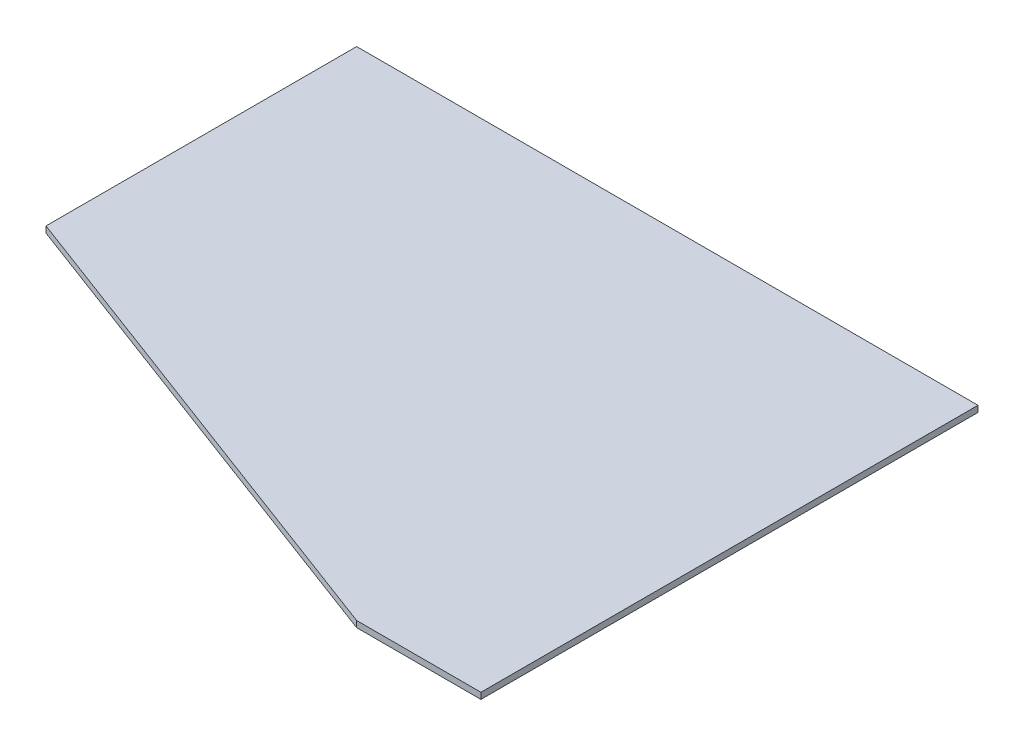
ISO-10303-21;
HEADER;
FILE_DESCRIPTION(('STEP AP214'),'2;1');
FILE_NAME('part.step','',(''),(''),'','','');
FILE_SCHEMA(('AUTOMOTIVE_DESIGN { 1 0 10303 214 1 1 1 1 }'));
ENDSEC;
DATA;
#1=APPLICATION_CONTEXT('core data for automotive mechanical design processes');
#2=APPLICATION_PROTOCOL_DEFINITION('international standard','automotive_design',2000,#1);
#3=PRODUCT_CONTEXT('',#1,'mechanical');
#4=PRODUCT('Part','Part','',(#3));
#5=PRODUCT_RELATED_PRODUCT_CATEGORY('part','',(#4));
#6=PRODUCT_DEFINITION_FORMATION('','',#4);
#7=PRODUCT_DEFINITION_CONTEXT('part definition',#1,'design');
#8=PRODUCT_DEFINITION('design','',#6,#7);
#9=PRODUCT_DEFINITION_SHAPE('','',#8);
#10=(LENGTH_UNIT() NAMED_UNIT(*) SI_UNIT(.MILLI.,.METRE.));
#11=(NAMED_UNIT(*) PLANE_ANGLE_UNIT() SI_UNIT($,.RADIAN.));
#12=(NAMED_UNIT(*) SI_UNIT($,.STERADIAN.) SOLID_ANGLE_UNIT());
#13=UNCERTAINTY_MEASURE_WITH_UNIT(LENGTH_MEASURE(1.E-05),#10,'distance_accuracy_value','');
#14=(GEOMETRIC_REPRESENTATION_CONTEXT(3) GLOBAL_UNCERTAINTY_ASSIGNED_CONTEXT((#13)) GLOBAL_UNIT_ASSIGNED_CONTEXT((#10,
#11,#12)) REPRESENTATION_CONTEXT('',''));
#15=CARTESIAN_POINT('',(0.,0.,0.));
#16=DIRECTION('',(0.,0.,1.));
#17=DIRECTION('',(1.,0.,0.));
#18=AXIS2_PLACEMENT_3D('',#15,#16,#17);
#19=CARTESIAN_POINT('',(1500.,10.,0.));
#20=DIRECTION('',(-1.,0.,0.));
#21=DIRECTION('',(0.,0.,1.));
#22=AXIS2_PLACEMENT_3D('',#19,#20,#21);
#23=PLANE('',#22);
#24=DIRECTION('',(0.,0.,-1.));
#25=VECTOR('',#24,1.);
#26=CARTESIAN_POINT('',(1500.,0.,0.));
#27=LINE('',#26,#25);
#28=CARTESIAN_POINT('',(1500.,0.,0.));
#29=VERTEX_POINT('',#28);
#30=CARTESIAN_POINT('',(1500.,0.,-800.));
#31=VERTEX_POINT('',#30);
#32=EDGE_CURVE('E109',#29,#31,#27,.T.);
#33=ORIENTED_EDGE('',*,*,#32,.T.);
#34=DIRECTION('',(0.,-1.,0.));
#35=VECTOR('',#34,1.);
#36=CARTESIAN_POINT('',(1500.,10.,-800.));
#37=LINE('',#36,#35);
#38=CARTESIAN_POINT('',(1500.,10.,-800.));
#39=VERTEX_POINT('',#38);
#40=EDGE_CURVE('E11',#39,#31,#37,.T.);
#41=ORIENTED_EDGE('',*,*,#40,.F.);
#42=DIRECTION('',(0.,0.,-1.));
#43=VECTOR('',#42,1.);
#44=CARTESIAN_POINT('',(1500.,10.,0.));
#45=LINE('',#44,#43);
#46=CARTESIAN_POINT('',(1500.,10.,0.));
#47=VERTEX_POINT('',#46);
#48=EDGE_CURVE('E118',#47,#39,#45,.T.);
#49=ORIENTED_EDGE('',*,*,#48,.F.);
#50=DIRECTION('',(0.,-1.,0.));
#51=VECTOR('',#50,1.);
#52=CARTESIAN_POINT('',(1500.,10.,0.));
#53=LINE('',#52,#51);
#54=EDGE_CURVE('E105',#47,#29,#53,.T.);
#55=ORIENTED_EDGE('',*,*,#54,.T.);
#56=EDGE_LOOP('',(#33,#41,#49,#55));
#57=FACE_BOUND('',#56,.T.);
#58=ADVANCED_FACE('F35',(#57),#23,.F.);
#59=CARTESIAN_POINT('',(500.,10.,-800.));
#60=DIRECTION('',(0.,0.,1.));
#61=DIRECTION('',(1.,0.,0.));
#62=AXIS2_PLACEMENT_3D('',#59,#60,#61);
#63=PLANE('',#62);
#64=DIRECTION('',(-1.,0.,0.));
#65=VECTOR('',#64,1.);
#66=CARTESIAN_POINT('',(500.,0.,-800.));
#67=LINE('',#66,#65);
#68=CARTESIAN_POINT('',(500.,0.,-800.));
#69=VERTEX_POINT('',#68);
#70=EDGE_CURVE('E112',#31,#69,#67,.T.);
#71=ORIENTED_EDGE('',*,*,#70,.T.);
#72=DIRECTION('',(0.,-1.,0.));
#73=VECTOR('',#72,1.);
#74=CARTESIAN_POINT('',(500.,10.,-800.));
#75=LINE('',#74,#73);
#76=CARTESIAN_POINT('',(500.,10.,-800.));
#77=VERTEX_POINT('',#76);
#78=EDGE_CURVE('E43',#77,#69,#75,.T.);
#79=ORIENTED_EDGE('',*,*,#78,.F.);
#80=DIRECTION('',(-1.,0.,0.));
#81=VECTOR('',#80,1.);
#82=CARTESIAN_POINT('',(500.,10.,-800.));
#83=LINE('',#82,#81);
#84=EDGE_CURVE('E85',#39,#77,#83,.T.);
#85=ORIENTED_EDGE('',*,*,#84,.F.);
#86=ORIENTED_EDGE('',*,*,#40,.T.);
#87=EDGE_LOOP('',(#71,#79,#85,#86));
#88=FACE_BOUND('',#87,.T.);
#89=ADVANCED_FACE('F137',(#88),#63,.F.);
#90=CARTESIAN_POINT('',(500.,10.,-300.));
#91=DIRECTION('',(1.,0.,0.));
#92=DIRECTION('',(0.,0.,-1.));
#93=AXIS2_PLACEMENT_3D('',#90,#91,#92);
#94=PLANE('',#93);
#95=DIRECTION('',(0.,0.,1.));
#96=VECTOR('',#95,1.);
#97=CARTESIAN_POINT('',(500.,0.,-300.));
#98=LINE('',#97,#96);
#99=CARTESIAN_POINT('',(500.,0.,-300.));
#100=VERTEX_POINT('',#99);
#101=EDGE_CURVE('E100',#69,#100,#98,.T.);
#102=ORIENTED_EDGE('',*,*,#101,.T.);
#103=DIRECTION('',(0.,-1.,0.));
#104=VECTOR('',#103,1.);
#105=CARTESIAN_POINT('',(500.,10.,-300.));
#106=LINE('',#105,#104);
#107=CARTESIAN_POINT('',(500.,10.,-300.));
#108=VERTEX_POINT('',#107);
#109=EDGE_CURVE('E97',#108,#100,#106,.T.);
#110=ORIENTED_EDGE('',*,*,#109,.F.);
#111=DIRECTION('',(0.,0.,1.));
#112=VECTOR('',#111,1.);
#113=CARTESIAN_POINT('',(500.,10.,-300.));
#114=LINE('',#113,#112);
#115=EDGE_CURVE('E89',#77,#108,#114,.T.);
#116=ORIENTED_EDGE('',*,*,#115,.F.);
#117=ORIENTED_EDGE('',*,*,#78,.T.);
#118=EDGE_LOOP('',(#102,#110,#116,#117));
#119=FACE_BOUND('',#118,.T.);
#120=ADVANCED_FACE('F98',(#119),#94,.F.);
#121=CARTESIAN_POINT('',(1300.,10.,0.));
#122=DIRECTION('',(0.351123441588391,0.,-0.936329177569045));
#123=DIRECTION('',(-0.936329177569045,0.,-0.351123441588392));
#124=AXIS2_PLACEMENT_3D('',#121,#122,#123);
#125=PLANE('',#124);
#126=DIRECTION('',(0.936329177569044,0.,0.351123441588391));
#127=VECTOR('',#126,1.);
#128=CARTESIAN_POINT('',(1300.,0.,0.));
#129=LINE('',#128,#127);
#130=CARTESIAN_POINT('',(1300.,0.,0.));
#131=VERTEX_POINT('',#130);
#132=EDGE_CURVE('E71',#100,#131,#129,.T.);
#133=ORIENTED_EDGE('',*,*,#132,.T.);
#134=DIRECTION('',(0.,-1.,0.));
#135=VECTOR('',#134,1.);
#136=CARTESIAN_POINT('',(1300.,10.,0.));
#137=LINE('',#136,#135);
#138=CARTESIAN_POINT('',(1300.,10.,0.));
#139=VERTEX_POINT('',#138);
#140=EDGE_CURVE('E101',#139,#131,#137,.T.);
#141=ORIENTED_EDGE('',*,*,#140,.F.);
#142=DIRECTION('',(0.936329177569044,0.,0.351123441588391));
#143=VECTOR('',#142,1.);
#144=CARTESIAN_POINT('',(1300.,10.,0.));
#145=LINE('',#144,#143);
#146=EDGE_CURVE('E93',#108,#139,#145,.T.);
#147=ORIENTED_EDGE('',*,*,#146,.F.);
#148=ORIENTED_EDGE('',*,*,#109,.T.);
#149=EDGE_LOOP('',(#133,#141,#147,#148));
#150=FACE_BOUND('',#149,.T.);
#151=ADVANCED_FACE('F103',(#150),#125,.F.);
#152=CARTESIAN_POINT('',(1300.,10.,0.));
#153=DIRECTION('',(0.,0.,-1.));
#154=DIRECTION('',(-1.,0.,0.));
#155=AXIS2_PLACEMENT_3D('',#152,#153,#154);
#156=PLANE('',#155);
#157=DIRECTION('',(1.,0.,0.));
#158=VECTOR('',#157,1.);
#159=CARTESIAN_POINT('',(1300.,0.,0.));
#160=LINE('',#159,#158);
#161=EDGE_CURVE('E77',#131,#29,#160,.T.);
#162=ORIENTED_EDGE('',*,*,#161,.T.);
#163=ORIENTED_EDGE('',*,*,#54,.F.);
#164=DIRECTION('',(1.,0.,0.));
#165=VECTOR('',#164,1.);
#166=CARTESIAN_POINT('',(1300.,10.,0.));
#167=LINE('',#166,#165);
#168=EDGE_CURVE('E51',#139,#47,#167,.T.);
#169=ORIENTED_EDGE('',*,*,#168,.F.);
#170=ORIENTED_EDGE('',*,*,#140,.T.);
#171=EDGE_LOOP('',(#162,#163,#169,#170));
#172=FACE_BOUND('',#171,.T.);
#173=ADVANCED_FACE('F126',(#172),#156,.F.);
#174=CARTESIAN_POINT('',(0.,10.,0.));
#175=DIRECTION('',(0.,-1.,0.));
#176=DIRECTION('',(0.,0.,-1.));
#177=AXIS2_PLACEMENT_3D('',#174,#175,#176);
#178=PLANE('',#177);
#179=ORIENTED_EDGE('',*,*,#48,.T.);
#180=ORIENTED_EDGE('',*,*,#84,.T.);
#181=ORIENTED_EDGE('',*,*,#115,.T.);
#182=ORIENTED_EDGE('',*,*,#146,.T.);
#183=ORIENTED_EDGE('',*,*,#168,.T.);
#184=EDGE_LOOP('',(#179,#180,#181,#182,#183));
#185=FACE_BOUND('',#184,.T.);
#186=ADVANCED_FACE('F91',(#185),#178,.F.);
#187=CARTESIAN_POINT('',(0.,0.,0.));
#188=DIRECTION('',(0.,-1.,0.));
#189=DIRECTION('',(0.,0.,-1.));
#190=AXIS2_PLACEMENT_3D('',#187,#188,#189);
#191=PLANE('',#190);
#192=CARTESIAN_POINT('',(1400.,0.,-700.));
#193=DIRECTION('',(0.,-1.,0.));
#194=DIRECTION('',(0.,0.,-1.));
#195=AXIS2_PLACEMENT_3D('',#192,#193,#194);
#196=CIRCLE('',#195,39.9999999999999);
#197=CARTESIAN_POINT('',(1400.,0.,-740.));
#198=VERTEX_POINT('',#197);
#199=EDGE_CURVE('E217',#198,#198,#196,.T.);
#200=ORIENTED_EDGE('',*,*,#199,.F.);
#201=EDGE_LOOP('',(#200));
#202=FACE_BOUND('',#201,.T.);
#203=CARTESIAN_POINT('',(1400.,0.,-120.));
#204=DIRECTION('',(0.,-1.,0.));
#205=DIRECTION('',(0.,0.,-1.));
#206=AXIS2_PLACEMENT_3D('',#203,#204,#205);
#207=CIRCLE('',#206,39.9999999999999);
#208=CARTESIAN_POINT('',(1400.,0.,-160.));
#209=VERTEX_POINT('',#208);
#210=EDGE_CURVE('E216',#209,#209,#207,.T.);
#211=ORIENTED_EDGE('',*,*,#210,.F.);
#212=EDGE_LOOP('',(#211));
#213=FACE_BOUND('',#212,.T.);
#214=ORIENTED_EDGE('',*,*,#32,.F.);
#215=ORIENTED_EDGE('',*,*,#161,.F.);
#216=ORIENTED_EDGE('',*,*,#132,.F.);
#217=ORIENTED_EDGE('',*,*,#101,.F.);
#218=ORIENTED_EDGE('',*,*,#70,.F.);
#219=EDGE_LOOP('',(#214,#215,#216,#217,#218));
#220=FACE_BOUND('',#219,.T.);
#221=ADVANCED_FACE('F122',(#202,#213,#220),#191,.T.);
#222=CARTESIAN_POINT('',(1400.,5.,-120.));
#223=DIRECTION('',(0.,-1.,0.));
#224=DIRECTION('',(0.,0.,-1.));
#225=AXIS2_PLACEMENT_3D('',#222,#223,#224);
#226=CYLINDRICAL_SURFACE('',#225,39.9999999999999);
#227=CARTESIAN_POINT('',(1400.,5.,-120.));
#228=DIRECTION('',(0.,-1.,0.));
#229=DIRECTION('',(0.,0.,-1.));
#230=AXIS2_PLACEMENT_3D('',#227,#228,#229);
#231=CIRCLE('',#230,39.9999999999999);
#232=CARTESIAN_POINT('',(1400.,5.,-160.));
#233=VERTEX_POINT('',#232);
#234=EDGE_CURVE('E113',#233,#233,#231,.T.);
#235=ORIENTED_EDGE('',*,*,#234,.F.);
#236=EDGE_LOOP('',(#235));
#237=FACE_BOUND('',#236,.T.);
#238=ORIENTED_EDGE('',*,*,#210,.T.);
#239=EDGE_LOOP('',(#238));
#240=FACE_BOUND('',#239,.T.);
#241=ADVANCED_FACE('F170',(#237,#240),#226,.F.);
#242=CARTESIAN_POINT('',(1400.,5.,-120.));
#243=DIRECTION('',(0.,-1.,0.));
#244=DIRECTION('',(0.,0.,-1.));
#245=AXIS2_PLACEMENT_3D('',#242,#243,#244);
#246=PLANE('',#245);
#247=ORIENTED_EDGE('',*,*,#234,.T.);
#248=EDGE_LOOP('',(#247));
#249=FACE_BOUND('',#248,.T.);
#250=ADVANCED_FACE('F179',(#249),#246,.T.);
#251=CARTESIAN_POINT('',(1400.,5.,-700.));
#252=DIRECTION('',(0.,-1.,0.));
#253=DIRECTION('',(0.,0.,-1.));
#254=AXIS2_PLACEMENT_3D('',#251,#252,#253);
#255=CYLINDRICAL_SURFACE('',#254,39.9999999999999);
#256=CARTESIAN_POINT('',(1400.,5.,-700.));
#257=DIRECTION('',(0.,-1.,0.));
#258=DIRECTION('',(0.,0.,-1.));
#259=AXIS2_PLACEMENT_3D('',#256,#257,#258);
#260=CIRCLE('',#259,39.9999999999999);
#261=CARTESIAN_POINT('',(1400.,5.,-740.));
#262=VERTEX_POINT('',#261);
#263=EDGE_CURVE('E215',#262,#262,#260,.T.);
#264=ORIENTED_EDGE('',*,*,#263,.F.);
#265=EDGE_LOOP('',(#264));
#266=FACE_BOUND('',#265,.T.);
#267=ORIENTED_EDGE('',*,*,#199,.T.);
#268=EDGE_LOOP('',(#267));
#269=FACE_BOUND('',#268,.T.);
#270=ADVANCED_FACE('F189',(#266,#269),#255,.F.);
#271=CARTESIAN_POINT('',(1400.,5.,-700.));
#272=DIRECTION('',(0.,-1.,0.));
#273=DIRECTION('',(0.,0.,-1.));
#274=AXIS2_PLACEMENT_3D('',#271,#272,#273);
#275=PLANE('',#274);
#276=ORIENTED_EDGE('',*,*,#263,.T.);
#277=EDGE_LOOP('',(#276));
#278=FACE_BOUND('',#277,.T.);
#279=ADVANCED_FACE('F199',(#278),#275,.T.);
#280=CLOSED_SHELL('',(#58,#89,#120,#151,#173,#186,#221,#241,#250,#270,#279));
#281=MANIFOLD_SOLID_BREP('B2',#280);
#282=ADVANCED_BREP_SHAPE_REPRESENTATION('',(#18,#281),#14);
#283=SHAPE_DEFINITION_REPRESENTATION(#9,#282);
ENDSEC;
END-ISO-10303-21;
